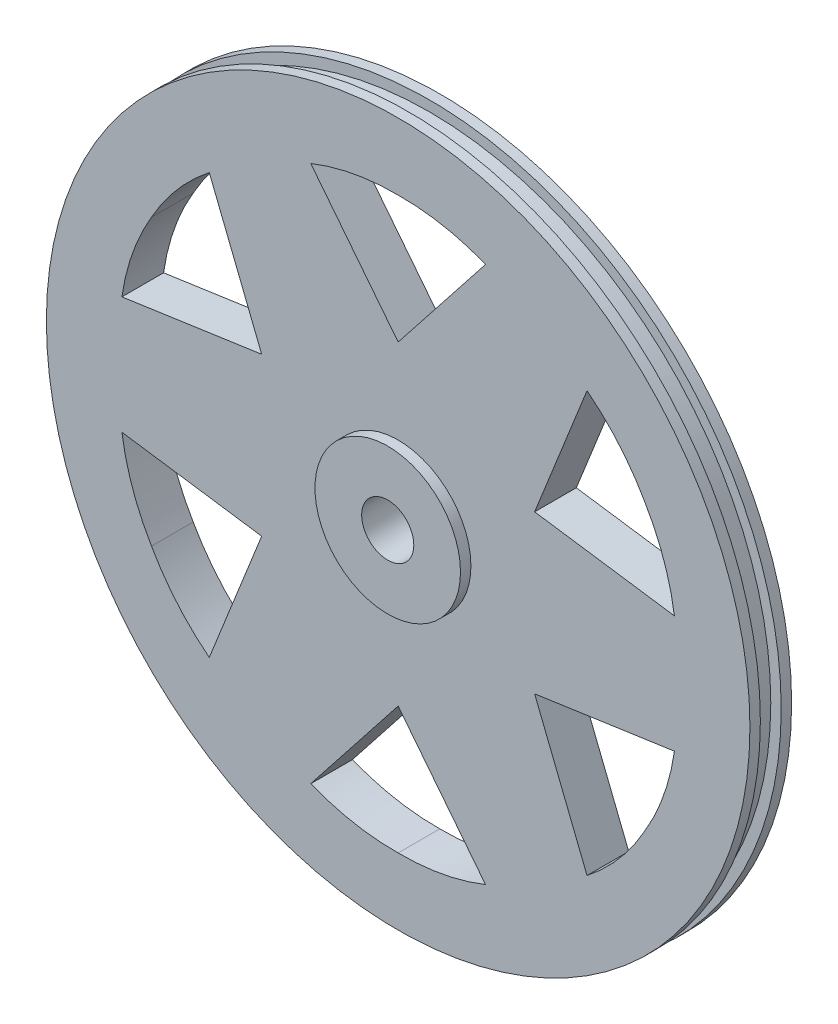
ISO-10303-21;
HEADER;
FILE_DESCRIPTION(('STEP AP214'),'2;1');
FILE_NAME('part.step','',(''),(''),'','','');
FILE_SCHEMA(('AUTOMOTIVE_DESIGN { 1 0 10303 214 1 1 1 1 }'));
ENDSEC;
DATA;
#1=APPLICATION_CONTEXT('core data for automotive mechanical design processes');
#2=APPLICATION_PROTOCOL_DEFINITION('international standard','automotive_design',2000,#1);
#3=PRODUCT_CONTEXT('',#1,'mechanical');
#4=PRODUCT('Part','Part','',(#3));
#5=PRODUCT_RELATED_PRODUCT_CATEGORY('part','',(#4));
#6=PRODUCT_DEFINITION_FORMATION('','',#4);
#7=PRODUCT_DEFINITION_CONTEXT('part definition',#1,'design');
#8=PRODUCT_DEFINITION('design','',#6,#7);
#9=PRODUCT_DEFINITION_SHAPE('','',#8);
#10=(LENGTH_UNIT() NAMED_UNIT(*) SI_UNIT(.MILLI.,.METRE.));
#11=(NAMED_UNIT(*) PLANE_ANGLE_UNIT() SI_UNIT($,.RADIAN.));
#12=(NAMED_UNIT(*) SI_UNIT($,.STERADIAN.) SOLID_ANGLE_UNIT());
#13=UNCERTAINTY_MEASURE_WITH_UNIT(LENGTH_MEASURE(1.E-05),#10,'distance_accuracy_value','');
#14=(GEOMETRIC_REPRESENTATION_CONTEXT(3) GLOBAL_UNCERTAINTY_ASSIGNED_CONTEXT((#13)) GLOBAL_UNIT_ASSIGNED_CONTEXT((#10,
#11,#12)) REPRESENTATION_CONTEXT('',''));
#15=CARTESIAN_POINT('',(0.,0.,0.));
#16=DIRECTION('',(0.,0.,1.));
#17=DIRECTION('',(1.,0.,0.));
#18=AXIS2_PLACEMENT_3D('',#15,#16,#17);
#19=CARTESIAN_POINT('',(0.,0.,4.));
#20=DIRECTION('',(0.,0.,1.));
#21=DIRECTION('',(1.,0.,0.));
#22=AXIS2_PLACEMENT_3D('',#19,#20,#21);
#23=PLANE('',#22);
#24=CARTESIAN_POINT('',(9.87087126814575,5.05606694384018,4.));
#25=DIRECTION('',(0.,0.,1.));
#26=DIRECTION('',(0.50000000000001,-0.866025403784433,0.));
#27=AXIS2_PLACEMENT_3D('',#24,#25,#26);
#28=CIRCLE('',#27,43.5801413510421);
#29=CARTESIAN_POINT('',(53.0096205020718,11.2429106229108,4.));
#30=VERTEX_POINT('',#29);
#31=CARTESIAN_POINT('',(47.3309241381744,27.3265217921694,4.));
#32=VERTEX_POINT('',#31);
#33=EDGE_CURVE('E301',#30,#32,#28,.T.);
#34=ORIENTED_EDGE('',*,*,#33,.F.);
#35=DIRECTION('',(0.989715541390064,-0.143049456940503,0.));
#36=VECTOR('',#35,1.);
#37=CARTESIAN_POINT('',(26.1879302612186,15.1196085858341,4.));
#38=LINE('',#37,#36);
#39=CARTESIAN_POINT('',(26.1879302612186,15.1196085858341,4.));
#40=VERTEX_POINT('',#39);
#41=EDGE_CURVE('E299',#40,#30,#38,.T.);
#42=ORIENTED_EDGE('',*,*,#41,.F.);
#43=DIRECTION('',(-0.370973306986966,-0.928643529834325,0.));
#44=VECTOR('',#43,1.);
#45=CARTESIAN_POINT('',(26.1879302612186,15.1196085858341,4.));
#46=LINE('',#45,#44);
#47=CARTESIAN_POINT('',(36.2414564629536,40.286222688312,4.));
#48=VERTEX_POINT('',#47);
#49=EDGE_CURVE('E306',#48,#40,#46,.T.);
#50=ORIENTED_EDGE('',*,*,#49,.F.);
#51=CARTESIAN_POINT('',(9.31411805067308,6.02039180378026,4.));
#52=DIRECTION('',(0.,0.,1.));
#53=DIRECTION('',(-0.50000000000001,0.866025403784433,0.));
#54=AXIS2_PLACEMENT_3D('',#51,#52,#53);
#55=CIRCLE('',#54,43.5801413510421);
#56=EDGE_CURVE('E304',#32,#48,#55,.T.);
#57=ORIENTED_EDGE('',*,*,#56,.F.);
#58=EDGE_LOOP('',(#34,#42,#50,#57));
#59=FACE_BOUND('',#58,.T.);
#60=CARTESIAN_POINT('',(9.3141180506732,-6.02039180378007,4.));
#61=DIRECTION('',(0.,0.,1.));
#62=DIRECTION('',(-0.499999999999992,-0.866025403784443,0.));
#63=AXIS2_PLACEMENT_3D('',#60,#61,#62);
#64=CIRCLE('',#63,43.5801413510421);
#65=CARTESIAN_POINT('',(36.2414564629545,-40.2862226883113,4.));
#66=VERTEX_POINT('',#65);
#67=CARTESIAN_POINT('',(47.3309241381749,-27.3265217921685,4.));
#68=VERTEX_POINT('',#67);
#69=EDGE_CURVE('E272',#66,#68,#64,.T.);
#70=ORIENTED_EDGE('',*,*,#69,.F.);
#71=DIRECTION('',(0.370973306986986,-0.928643529834317,0.));
#72=VECTOR('',#71,1.);
#73=CARTESIAN_POINT('',(26.1879302612189,-15.1196085858336,4.));
#74=LINE('',#73,#72);
#75=CARTESIAN_POINT('',(26.1879302612189,-15.1196085858336,4.));
#76=VERTEX_POINT('',#75);
#77=EDGE_CURVE('E270',#76,#66,#74,.T.);
#78=ORIENTED_EDGE('',*,*,#77,.F.);
#79=DIRECTION('',(-0.989715541390061,-0.143049456940524,0.));
#80=VECTOR('',#79,1.);
#81=CARTESIAN_POINT('',(26.1879302612189,-15.1196085858336,4.));
#82=LINE('',#81,#80);
#83=CARTESIAN_POINT('',(53.009620502072,-11.2429106229096,4.));
#84=VERTEX_POINT('',#83);
#85=EDGE_CURVE('E277',#84,#76,#82,.T.);
#86=ORIENTED_EDGE('',*,*,#85,.F.);
#87=CARTESIAN_POINT('',(9.87087126814585,-5.05606694383997,4.));
#88=DIRECTION('',(0.,0.,1.));
#89=DIRECTION('',(0.499999999999992,0.866025403784443,0.));
#90=AXIS2_PLACEMENT_3D('',#87,#88,#89);
#91=CIRCLE('',#90,43.5801413510421);
#92=EDGE_CURVE('E275',#68,#84,#91,.T.);
#93=ORIENTED_EDGE('',*,*,#92,.F.);
#94=EDGE_LOOP('',(#70,#78,#86,#93));
#95=FACE_BOUND('',#94,.T.);
#96=CARTESIAN_POINT('',(-0.556753217472661,-11.0764587476202,4.));
#97=DIRECTION('',(0.,0.,1.));
#98=DIRECTION('',(-1.,0.,0.));
#99=AXIS2_PLACEMENT_3D('',#96,#97,#98);
#100=CIRCLE('',#99,43.5801413510421);
#101=CARTESIAN_POINT('',(-16.7681640391178,-51.5291333112218,4.));
#102=VERTEX_POINT('',#101);
#103=CARTESIAN_POINT('',(0.,-54.6530435843378,4.));
#104=VERTEX_POINT('',#103);
#105=EDGE_CURVE('E241',#102,#104,#100,.T.);
#106=ORIENTED_EDGE('',*,*,#105,.F.);
#107=DIRECTION('',(-0.618742234403085,-0.785594072893805,0.));
#108=VECTOR('',#107,1.);
#109=CARTESIAN_POINT('',(0.,-30.2392171716676,4.));
#110=LINE('',#109,#108);
#111=CARTESIAN_POINT('',(0.,-30.2392171716676,4.));
#112=VERTEX_POINT('',#111);
#113=EDGE_CURVE('E239',#112,#102,#110,.T.);
#114=ORIENTED_EDGE('',*,*,#113,.F.);
#115=DIRECTION('',(-0.618742234403085,0.785594072893805,0.));
#116=VECTOR('',#115,1.);
#117=CARTESIAN_POINT('',(0.,-30.2392171716676,4.));
#118=LINE('',#117,#116);
#119=CARTESIAN_POINT('',(16.7681640391179,-51.5291333112218,4.));
#120=VERTEX_POINT('',#119);
#121=EDGE_CURVE('E247',#120,#112,#118,.T.);
#122=ORIENTED_EDGE('',*,*,#121,.F.);
#123=CARTESIAN_POINT('',(0.556753217472661,-11.0764587476202,4.));
#124=DIRECTION('',(0.,0.,1.));
#125=DIRECTION('',(1.,0.,0.));
#126=AXIS2_PLACEMENT_3D('',#123,#124,#125);
#127=CIRCLE('',#126,43.5801413510421);
#128=EDGE_CURVE('E244',#104,#120,#127,.T.);
#129=ORIENTED_EDGE('',*,*,#128,.F.);
#130=EDGE_LOOP('',(#106,#114,#122,#129));
#131=FACE_BOUND('',#130,.T.);
#132=CARTESIAN_POINT('',(-9.87087126814579,-5.05606694384011,4.));
#133=DIRECTION('',(0.,0.,1.));
#134=DIRECTION('',(-0.500000000000004,0.866025403784436,0.));
#135=AXIS2_PLACEMENT_3D('',#132,#133,#134);
#136=CIRCLE('',#135,43.5801413510421);
#137=CARTESIAN_POINT('',(-53.0096205020719,-11.2429106229104,4.));
#138=VERTEX_POINT('',#137);
#139=CARTESIAN_POINT('',(-47.3309241381746,-27.3265217921691,4.));
#140=VERTEX_POINT('',#139);
#141=EDGE_CURVE('E205',#138,#140,#136,.T.);
#142=ORIENTED_EDGE('',*,*,#141,.F.);
#143=DIRECTION('',(-0.989715541390063,0.14304945694051,0.));
#144=VECTOR('',#143,1.);
#145=CARTESIAN_POINT('',(-26.1879302612187,-15.1196085858339,4.));
#146=LINE('',#145,#144);
#147=CARTESIAN_POINT('',(-26.1879302612187,-15.1196085858339,4.));
#148=VERTEX_POINT('',#147);
#149=EDGE_CURVE('E195',#148,#138,#146,.T.);
#150=ORIENTED_EDGE('',*,*,#149,.F.);
#151=DIRECTION('',(0.370973306986973,0.928643529834322,0.));
#152=VECTOR('',#151,1.);
#153=CARTESIAN_POINT('',(-26.1879302612187,-15.1196085858339,4.));
#154=LINE('',#153,#152);
#155=CARTESIAN_POINT('',(-36.2414564629539,-40.2862226883118,4.));
#156=VERTEX_POINT('',#155);
#157=EDGE_CURVE('E221',#156,#148,#154,.T.);
#158=ORIENTED_EDGE('',*,*,#157,.F.);
#159=CARTESIAN_POINT('',(-9.31411805067312,-6.0203918037802,4.));
#160=DIRECTION('',(0.,0.,1.));
#161=DIRECTION('',(0.500000000000004,-0.866025403784436,0.));
#162=AXIS2_PLACEMENT_3D('',#159,#160,#161);
#163=CIRCLE('',#162,43.5801413510421);
#164=EDGE_CURVE('E219',#140,#156,#163,.T.);
#165=ORIENTED_EDGE('',*,*,#164,.F.);
#166=EDGE_LOOP('',(#142,#150,#158,#165));
#167=FACE_BOUND('',#166,.T.);
#168=CARTESIAN_POINT('',(-9.31411805067316,6.02039180378013,4.));
#169=DIRECTION('',(0.,0.,1.));
#170=DIRECTION('',(0.499999999999998,0.86602540378444,0.));
#171=AXIS2_PLACEMENT_3D('',#168,#169,#170);
#172=CIRCLE('',#171,43.5801413510421);
#173=CARTESIAN_POINT('',(-36.2414564629542,40.2862226883115,4.));
#174=VERTEX_POINT('',#173);
#175=CARTESIAN_POINT('',(-47.3309241381747,27.3265217921688,4.));
#176=VERTEX_POINT('',#175);
#177=EDGE_CURVE('E330',#174,#176,#172,.T.);
#178=ORIENTED_EDGE('',*,*,#177,.F.);
#179=DIRECTION('',(-0.370973306986979,0.928643529834319,0.));
#180=VECTOR('',#179,1.);
#181=CARTESIAN_POINT('',(-26.1879302612188,15.1196085858337,4.));
#182=LINE('',#181,#180);
#183=CARTESIAN_POINT('',(-26.1879302612188,15.1196085858337,4.));
#184=VERTEX_POINT('',#183);
#185=EDGE_CURVE('E328',#184,#174,#182,.T.);
#186=ORIENTED_EDGE('',*,*,#185,.F.);
#187=DIRECTION('',(0.989715541390062,0.143049456940517,0.));
#188=VECTOR('',#187,1.);
#189=CARTESIAN_POINT('',(-26.1879302612188,15.1196085858337,4.));
#190=LINE('',#189,#188);
#191=CARTESIAN_POINT('',(-53.0096205020719,11.24291062291,4.));
#192=VERTEX_POINT('',#191);
#193=EDGE_CURVE('E336',#192,#184,#190,.T.);
#194=ORIENTED_EDGE('',*,*,#193,.F.);
#195=CARTESIAN_POINT('',(-9.87087126814582,5.05606694384004,4.));
#196=DIRECTION('',(0.,0.,1.));
#197=DIRECTION('',(-0.499999999999998,-0.86602540378444,0.));
#198=AXIS2_PLACEMENT_3D('',#195,#196,#197);
#199=CIRCLE('',#198,43.5801413510421);
#200=EDGE_CURVE('E333',#176,#192,#199,.T.);
#201=ORIENTED_EDGE('',*,*,#200,.F.);
#202=EDGE_LOOP('',(#178,#186,#194,#201));
#203=FACE_BOUND('',#202,.T.);
#204=CARTESIAN_POINT('',(0.556753217472661,11.0764587476202,4.));
#205=DIRECTION('',(0.,0.,1.));
#206=DIRECTION('',(1.,0.,0.));
#207=AXIS2_PLACEMENT_3D('',#204,#205,#206);
#208=CIRCLE('',#207,43.5801413510421);
#209=CARTESIAN_POINT('',(16.7681640391178,51.5291333112218,4.));
#210=VERTEX_POINT('',#209);
#211=CARTESIAN_POINT('',(0.,54.6530435843378,4.));
#212=VERTEX_POINT('',#211);
#213=EDGE_CURVE('E361',#210,#212,#208,.T.);
#214=ORIENTED_EDGE('',*,*,#213,.F.);
#215=DIRECTION('',(0.618742234403085,0.785594072893805,0.));
#216=VECTOR('',#215,1.);
#217=CARTESIAN_POINT('',(0.,30.2392171716676,4.));
#218=LINE('',#217,#216);
#219=CARTESIAN_POINT('',(0.,30.2392171716676,4.));
#220=VERTEX_POINT('',#219);
#221=EDGE_CURVE('E359',#220,#210,#218,.T.);
#222=ORIENTED_EDGE('',*,*,#221,.F.);
#223=DIRECTION('',(0.618742234403085,-0.785594072893805,0.));
#224=VECTOR('',#223,1.);
#225=CARTESIAN_POINT('',(0.,30.2392171716676,4.));
#226=LINE('',#225,#224);
#227=CARTESIAN_POINT('',(-16.7681640391179,51.5291333112218,4.));
#228=VERTEX_POINT('',#227);
#229=EDGE_CURVE('E367',#228,#220,#226,.T.);
#230=ORIENTED_EDGE('',*,*,#229,.F.);
#231=CARTESIAN_POINT('',(-0.556753217472661,11.0764587476202,4.));
#232=DIRECTION('',(0.,0.,1.));
#233=DIRECTION('',(-1.,0.,0.));
#234=AXIS2_PLACEMENT_3D('',#231,#232,#233);
#235=CIRCLE('',#234,43.5801413510421);
#236=EDGE_CURVE('E364',#212,#228,#235,.T.);
#237=ORIENTED_EDGE('',*,*,#236,.F.);
#238=EDGE_LOOP('',(#214,#222,#230,#237));
#239=FACE_BOUND('',#238,.T.);
#240=CARTESIAN_POINT('',(0.,0.,4.));
#241=DIRECTION('',(0.,0.,1.));
#242=DIRECTION('',(1.,0.,0.));
#243=AXIS2_PLACEMENT_3D('',#240,#241,#242);
#244=CIRCLE('',#243,67.5);
#245=CARTESIAN_POINT('',(67.5,0.,4.));
#246=VERTEX_POINT('',#245);
#247=EDGE_CURVE('E11',#246,#246,#244,.T.);
#248=ORIENTED_EDGE('',*,*,#247,.T.);
#249=EDGE_LOOP('',(#248));
#250=FACE_BOUND('',#249,.T.);
#251=CARTESIAN_POINT('',(0.,0.,4.));
#252=DIRECTION('',(0.,0.,1.));
#253=DIRECTION('',(1.,0.,0.));
#254=AXIS2_PLACEMENT_3D('',#251,#252,#253);
#255=CIRCLE('',#254,13.9623807491948);
#256=CARTESIAN_POINT('',(13.9623807491948,0.,4.));
#257=VERTEX_POINT('',#256);
#258=EDGE_CURVE('E767',#257,#257,#255,.T.);
#259=ORIENTED_EDGE('',*,*,#258,.F.);
#260=EDGE_LOOP('',(#259));
#261=FACE_BOUND('',#260,.T.);
#262=ADVANCED_FACE('F33',(#59,#95,#131,#167,#203,#239,#250,#261),#23,.T.);
#263=CARTESIAN_POINT('',(0.,0.,4.));
#264=DIRECTION('',(0.,0.,-1.));
#265=DIRECTION('',(-1.,0.,0.));
#266=AXIS2_PLACEMENT_3D('',#263,#264,#265);
#267=CYLINDRICAL_SURFACE('',#266,67.5);
#268=CARTESIAN_POINT('',(0.,0.,-4.));
#269=DIRECTION('',(0.,0.,1.));
#270=DIRECTION('',(1.,0.,0.));
#271=AXIS2_PLACEMENT_3D('',#268,#269,#270);
#272=CIRCLE('',#271,67.5);
#273=CARTESIAN_POINT('',(67.5,0.,-4.));
#274=VERTEX_POINT('',#273);
#275=EDGE_CURVE('E37',#274,#274,#272,.T.);
#276=ORIENTED_EDGE('',*,*,#275,.T.);
#277=EDGE_LOOP('',(#276));
#278=FACE_BOUND('',#277,.T.);
#279=CARTESIAN_POINT('',(0.,0.,-2.));
#280=DIRECTION('',(0.,0.,1.));
#281=DIRECTION('',(1.,0.,0.));
#282=AXIS2_PLACEMENT_3D('',#279,#280,#281);
#283=CIRCLE('',#282,67.5);
#284=CARTESIAN_POINT('',(67.5,0.,-2.));
#285=VERTEX_POINT('',#284);
#286=EDGE_CURVE('E313',#285,#285,#283,.T.);
#287=ORIENTED_EDGE('',*,*,#286,.F.);
#288=EDGE_LOOP('',(#287));
#289=FACE_BOUND('',#288,.T.);
#290=ADVANCED_FACE('F396',(#278,#289),#267,.T.);
#291=CARTESIAN_POINT('',(0.,0.,-4.));
#292=DIRECTION('',(0.,0.,1.));
#293=DIRECTION('',(1.,0.,0.));
#294=AXIS2_PLACEMENT_3D('',#291,#292,#293);
#295=PLANE('',#294);
#296=DIRECTION('',(0.370973306986986,-0.928643529834317,0.));
#297=VECTOR('',#296,1.);
#298=CARTESIAN_POINT('',(26.1879302612189,-15.1196085858336,-4.));
#299=LINE('',#298,#297);
#300=CARTESIAN_POINT('',(26.1879302612189,-15.1196085858336,-4.));
#301=VERTEX_POINT('',#300);
#302=CARTESIAN_POINT('',(36.2414564629545,-40.2862226883113,-4.));
#303=VERTEX_POINT('',#302);
#304=EDGE_CURVE('E280',#301,#303,#299,.T.);
#305=ORIENTED_EDGE('',*,*,#304,.T.);
#306=CARTESIAN_POINT('',(9.3141180506732,-6.02039180378007,-4.));
#307=DIRECTION('',(0.,0.,1.));
#308=DIRECTION('',(-0.499999999999992,-0.866025403784443,0.));
#309=AXIS2_PLACEMENT_3D('',#306,#307,#308);
#310=CIRCLE('',#309,43.5801413510421);
#311=CARTESIAN_POINT('',(47.3309241381749,-27.3265217921685,-4.));
#312=VERTEX_POINT('',#311);
#313=EDGE_CURVE('E283',#303,#312,#310,.T.);
#314=ORIENTED_EDGE('',*,*,#313,.T.);
#315=CARTESIAN_POINT('',(9.87087126814585,-5.05606694383997,-4.));
#316=DIRECTION('',(0.,0.,1.));
#317=DIRECTION('',(0.499999999999992,0.866025403784443,0.));
#318=AXIS2_PLACEMENT_3D('',#315,#316,#317);
#319=CIRCLE('',#318,43.5801413510421);
#320=CARTESIAN_POINT('',(53.009620502072,-11.2429106229096,-4.));
#321=VERTEX_POINT('',#320);
#322=EDGE_CURVE('E287',#312,#321,#319,.T.);
#323=ORIENTED_EDGE('',*,*,#322,.T.);
#324=DIRECTION('',(-0.989715541390061,-0.143049456940524,0.));
#325=VECTOR('',#324,1.);
#326=CARTESIAN_POINT('',(26.1879302612189,-15.1196085858336,-4.));
#327=LINE('',#326,#325);
#328=EDGE_CURVE('E273',#321,#301,#327,.T.);
#329=ORIENTED_EDGE('',*,*,#328,.T.);
#330=EDGE_LOOP('',(#305,#314,#323,#329));
#331=FACE_BOUND('',#330,.T.);
#332=DIRECTION('',(-0.989715541390063,0.14304945694051,0.));
#333=VECTOR('',#332,1.);
#334=CARTESIAN_POINT('',(-26.1879302612187,-15.1196085858339,-4.));
#335=LINE('',#334,#333);
#336=CARTESIAN_POINT('',(-26.1879302612187,-15.1196085858339,-4.));
#337=VERTEX_POINT('',#336);
#338=CARTESIAN_POINT('',(-53.0096205020719,-11.2429106229104,-4.));
#339=VERTEX_POINT('',#338);
#340=EDGE_CURVE('E226',#337,#339,#335,.T.);
#341=ORIENTED_EDGE('',*,*,#340,.T.);
#342=CARTESIAN_POINT('',(-9.87087126814579,-5.05606694384011,-4.));
#343=DIRECTION('',(0.,0.,1.));
#344=DIRECTION('',(-0.500000000000004,0.866025403784436,0.));
#345=AXIS2_PLACEMENT_3D('',#342,#343,#344);
#346=CIRCLE('',#345,43.5801413510421);
#347=CARTESIAN_POINT('',(-47.3309241381746,-27.3265217921691,-4.));
#348=VERTEX_POINT('',#347);
#349=EDGE_CURVE('E212',#339,#348,#346,.T.);
#350=ORIENTED_EDGE('',*,*,#349,.T.);
#351=CARTESIAN_POINT('',(-9.31411805067312,-6.0203918037802,-4.));
#352=DIRECTION('',(0.,0.,1.));
#353=DIRECTION('',(0.500000000000004,-0.866025403784436,0.));
#354=AXIS2_PLACEMENT_3D('',#351,#352,#353);
#355=CIRCLE('',#354,43.5801413510421);
#356=CARTESIAN_POINT('',(-36.2414564629539,-40.2862226883118,-4.));
#357=VERTEX_POINT('',#356);
#358=EDGE_CURVE('E230',#348,#357,#355,.T.);
#359=ORIENTED_EDGE('',*,*,#358,.T.);
#360=DIRECTION('',(0.370973306986973,0.928643529834322,0.));
#361=VECTOR('',#360,1.);
#362=CARTESIAN_POINT('',(-26.1879302612187,-15.1196085858339,-4.));
#363=LINE('',#362,#361);
#364=EDGE_CURVE('E206',#357,#337,#363,.T.);
#365=ORIENTED_EDGE('',*,*,#364,.T.);
#366=EDGE_LOOP('',(#341,#350,#359,#365));
#367=FACE_BOUND('',#366,.T.);
#368=DIRECTION('',(0.618742234403085,0.785594072893805,0.));
#369=VECTOR('',#368,1.);
#370=CARTESIAN_POINT('',(0.,30.2392171716676,-4.));
#371=LINE('',#370,#369);
#372=CARTESIAN_POINT('',(0.,30.2392171716676,-4.));
#373=VERTEX_POINT('',#372);
#374=CARTESIAN_POINT('',(16.7681640391178,51.5291333112218,-4.));
#375=VERTEX_POINT('',#374);
#376=EDGE_CURVE('E358',#373,#375,#371,.T.);
#377=ORIENTED_EDGE('',*,*,#376,.T.);
#378=CARTESIAN_POINT('',(0.556753217472661,11.0764587476202,-4.));
#379=DIRECTION('',(0.,0.,1.));
#380=DIRECTION('',(1.,0.,0.));
#381=AXIS2_PLACEMENT_3D('',#378,#379,#380);
#382=CIRCLE('',#381,43.5801413510421);
#383=CARTESIAN_POINT('',(0.,54.6530435843378,-4.));
#384=VERTEX_POINT('',#383);
#385=EDGE_CURVE('E372',#375,#384,#382,.T.);
#386=ORIENTED_EDGE('',*,*,#385,.T.);
#387=CARTESIAN_POINT('',(-0.556753217472661,11.0764587476202,-4.));
#388=DIRECTION('',(0.,0.,1.));
#389=DIRECTION('',(-1.,0.,0.));
#390=AXIS2_PLACEMENT_3D('',#387,#388,#389);
#391=CIRCLE('',#390,43.5801413510421);
#392=CARTESIAN_POINT('',(-16.7681640391178,51.5291333112218,-4.));
#393=VERTEX_POINT('',#392);
#394=EDGE_CURVE('E375',#384,#393,#391,.T.);
#395=ORIENTED_EDGE('',*,*,#394,.T.);
#396=DIRECTION('',(0.618742234403085,-0.785594072893805,0.));
#397=VECTOR('',#396,1.);
#398=CARTESIAN_POINT('',(0.,30.2392171716676,-4.));
#399=LINE('',#398,#397);
#400=EDGE_CURVE('E362',#393,#373,#399,.T.);
#401=ORIENTED_EDGE('',*,*,#400,.T.);
#402=EDGE_LOOP('',(#377,#386,#395,#401));
#403=FACE_BOUND('',#402,.T.);
#404=ORIENTED_EDGE('',*,*,#275,.F.);
#405=EDGE_LOOP('',(#404));
#406=FACE_BOUND('',#405,.T.);
#407=CARTESIAN_POINT('',(0.,0.,-4.));
#408=DIRECTION('',(0.,0.,1.));
#409=DIRECTION('',(1.,0.,0.));
#410=AXIS2_PLACEMENT_3D('',#407,#408,#409);
#411=CIRCLE('',#410,5.);
#412=CARTESIAN_POINT('',(5.,0.,-4.));
#413=VERTEX_POINT('',#412);
#414=EDGE_CURVE('E389',#413,#413,#411,.T.);
#415=ORIENTED_EDGE('',*,*,#414,.T.);
#416=EDGE_LOOP('',(#415));
#417=FACE_BOUND('',#416,.T.);
#418=DIRECTION('',(-0.370973306986979,0.928643529834319,0.));
#419=VECTOR('',#418,1.);
#420=CARTESIAN_POINT('',(-26.1879302612188,15.1196085858337,-4.));
#421=LINE('',#420,#419);
#422=CARTESIAN_POINT('',(-26.1879302612188,15.1196085858337,-4.));
#423=VERTEX_POINT('',#422);
#424=CARTESIAN_POINT('',(-36.2414564629542,40.2862226883115,-4.));
#425=VERTEX_POINT('',#424);
#426=EDGE_CURVE('E213',#423,#425,#421,.T.);
#427=ORIENTED_EDGE('',*,*,#426,.T.);
#428=CARTESIAN_POINT('',(-9.31411805067316,6.02039180378013,-4.));
#429=DIRECTION('',(0.,0.,1.));
#430=DIRECTION('',(0.499999999999998,0.86602540378444,0.));
#431=AXIS2_PLACEMENT_3D('',#428,#429,#430);
#432=CIRCLE('',#431,43.5801413510421);
#433=CARTESIAN_POINT('',(-47.3309241381747,27.3265217921688,-4.));
#434=VERTEX_POINT('',#433);
#435=EDGE_CURVE('E341',#425,#434,#432,.T.);
#436=ORIENTED_EDGE('',*,*,#435,.T.);
#437=CARTESIAN_POINT('',(-9.87087126814582,5.05606694384004,-4.));
#438=DIRECTION('',(0.,0.,1.));
#439=DIRECTION('',(-0.499999999999998,-0.86602540378444,0.));
#440=AXIS2_PLACEMENT_3D('',#437,#438,#439);
#441=CIRCLE('',#440,43.5801413510421);
#442=CARTESIAN_POINT('',(-53.0096205020719,11.24291062291,-4.));
#443=VERTEX_POINT('',#442);
#444=EDGE_CURVE('E344',#434,#443,#441,.T.);
#445=ORIENTED_EDGE('',*,*,#444,.T.);
#446=DIRECTION('',(0.989715541390062,0.143049456940517,0.));
#447=VECTOR('',#446,1.);
#448=CARTESIAN_POINT('',(-26.1879302612188,15.1196085858337,-4.));
#449=LINE('',#448,#447);
#450=EDGE_CURVE('E331',#443,#423,#449,.T.);
#451=ORIENTED_EDGE('',*,*,#450,.T.);
#452=EDGE_LOOP('',(#427,#436,#445,#451));
#453=FACE_BOUND('',#452,.T.);
#454=DIRECTION('',(-0.618742234403085,-0.785594072893805,0.));
#455=VECTOR('',#454,1.);
#456=CARTESIAN_POINT('',(0.,-30.2392171716676,-4.));
#457=LINE('',#456,#455);
#458=CARTESIAN_POINT('',(0.,-30.2392171716676,-4.));
#459=VERTEX_POINT('',#458);
#460=CARTESIAN_POINT('',(-16.7681640391178,-51.5291333112218,-4.));
#461=VERTEX_POINT('',#460);
#462=EDGE_CURVE('E250',#459,#461,#457,.T.);
#463=ORIENTED_EDGE('',*,*,#462,.T.);
#464=CARTESIAN_POINT('',(-0.556753217472661,-11.0764587476202,-4.));
#465=DIRECTION('',(0.,0.,1.));
#466=DIRECTION('',(-1.,0.,0.));
#467=AXIS2_PLACEMENT_3D('',#464,#465,#466);
#468=CIRCLE('',#467,43.5801413510421);
#469=CARTESIAN_POINT('',(0.,-54.6530435843378,-4.));
#470=VERTEX_POINT('',#469);
#471=EDGE_CURVE('E253',#461,#470,#468,.T.);
#472=ORIENTED_EDGE('',*,*,#471,.T.);
#473=CARTESIAN_POINT('',(0.556753217472661,-11.0764587476202,-4.));
#474=DIRECTION('',(0.,0.,1.));
#475=DIRECTION('',(1.,0.,0.));
#476=AXIS2_PLACEMENT_3D('',#473,#474,#475);
#477=CIRCLE('',#476,43.5801413510421);
#478=CARTESIAN_POINT('',(16.7681640391178,-51.5291333112218,-4.));
#479=VERTEX_POINT('',#478);
#480=EDGE_CURVE('E257',#470,#479,#477,.T.);
#481=ORIENTED_EDGE('',*,*,#480,.T.);
#482=DIRECTION('',(-0.618742234403085,0.785594072893805,0.));
#483=VECTOR('',#482,1.);
#484=CARTESIAN_POINT('',(0.,-30.2392171716676,-4.));
#485=LINE('',#484,#483);
#486=EDGE_CURVE('E242',#479,#459,#485,.T.);
#487=ORIENTED_EDGE('',*,*,#486,.T.);
#488=EDGE_LOOP('',(#463,#472,#481,#487));
#489=FACE_BOUND('',#488,.T.);
#490=DIRECTION('',(0.989715541390064,-0.143049456940503,0.));
#491=VECTOR('',#490,1.);
#492=CARTESIAN_POINT('',(26.1879302612186,15.1196085858341,-4.));
#493=LINE('',#492,#491);
#494=CARTESIAN_POINT('',(26.1879302612186,15.1196085858341,-4.));
#495=VERTEX_POINT('',#494);
#496=CARTESIAN_POINT('',(53.0096205020718,11.2429106229108,-4.));
#497=VERTEX_POINT('',#496);
#498=EDGE_CURVE('E309',#495,#497,#493,.T.);
#499=ORIENTED_EDGE('',*,*,#498,.T.);
#500=CARTESIAN_POINT('',(9.87087126814575,5.05606694384018,-4.));
#501=DIRECTION('',(0.,0.,1.));
#502=DIRECTION('',(0.50000000000001,-0.866025403784433,0.));
#503=AXIS2_PLACEMENT_3D('',#500,#501,#502);
#504=CIRCLE('',#503,43.5801413510421);
#505=CARTESIAN_POINT('',(47.3309241381744,27.3265217921694,-4.));
#506=VERTEX_POINT('',#505);
#507=EDGE_CURVE('E312',#497,#506,#504,.T.);
#508=ORIENTED_EDGE('',*,*,#507,.T.);
#509=CARTESIAN_POINT('',(9.31411805067308,6.02039180378026,-4.));
#510=DIRECTION('',(0.,0.,1.));
#511=DIRECTION('',(-0.50000000000001,0.866025403784433,0.));
#512=AXIS2_PLACEMENT_3D('',#509,#510,#511);
#513=CIRCLE('',#512,43.5801413510421);
#514=CARTESIAN_POINT('',(36.2414564629536,40.286222688312,-4.));
#515=VERTEX_POINT('',#514);
#516=EDGE_CURVE('E316',#506,#515,#513,.T.);
#517=ORIENTED_EDGE('',*,*,#516,.T.);
#518=DIRECTION('',(-0.370973306986966,-0.928643529834325,0.));
#519=VECTOR('',#518,1.);
#520=CARTESIAN_POINT('',(26.1879302612186,15.1196085858341,-4.));
#521=LINE('',#520,#519);
#522=EDGE_CURVE('E302',#515,#495,#521,.T.);
#523=ORIENTED_EDGE('',*,*,#522,.T.);
#524=EDGE_LOOP('',(#499,#508,#517,#523));
#525=FACE_BOUND('',#524,.T.);
#526=ADVANCED_FACE('F399',(#331,#367,#403,#406,#417,#453,#489,#525),#295,.F.);
#527=CARTESIAN_POINT('',(0.,0.,2.));
#528=DIRECTION('',(0.,0.,1.));
#529=DIRECTION('',(1.,0.,0.));
#530=AXIS2_PLACEMENT_3D('',#527,#528,#529);
#531=CIRCLE('',#530,67.5);
#532=CARTESIAN_POINT('',(67.5,0.,2.));
#533=VERTEX_POINT('',#532);
#534=EDGE_CURVE('E779',#533,#533,#531,.T.);
#535=ORIENTED_EDGE('',*,*,#534,.T.);
#536=EDGE_LOOP('',(#535));
#537=FACE_BOUND('',#536,.T.);
#538=ORIENTED_EDGE('',*,*,#247,.F.);
#539=EDGE_LOOP('',(#538));
#540=FACE_BOUND('',#539,.T.);
#541=ADVANCED_FACE('F35',(#537,#540),#267,.T.);
#542=CARTESIAN_POINT('',(0.,0.,4.));
#543=DIRECTION('',(0.,0.,-1.));
#544=DIRECTION('',(-1.,0.,0.));
#545=AXIS2_PLACEMENT_3D('',#542,#543,#544);
#546=CYLINDRICAL_SURFACE('',#545,5.);
#547=ORIENTED_EDGE('',*,*,#414,.F.);
#548=EDGE_LOOP('',(#547));
#549=FACE_BOUND('',#548,.T.);
#550=CARTESIAN_POINT('',(0.,0.,6.));
#551=DIRECTION('',(0.,0.,1.));
#552=DIRECTION('',(1.,0.,0.));
#553=AXIS2_PLACEMENT_3D('',#550,#551,#552);
#554=CIRCLE('',#553,5.);
#555=CARTESIAN_POINT('',(5.,0.,6.));
#556=VERTEX_POINT('',#555);
#557=EDGE_CURVE('E769',#556,#556,#554,.T.);
#558=ORIENTED_EDGE('',*,*,#557,.T.);
#559=EDGE_LOOP('',(#558));
#560=FACE_BOUND('',#559,.T.);
#561=ADVANCED_FACE('F439',(#549,#560),#546,.F.);
#562=CARTESIAN_POINT('',(0.,30.2392171716676,4.));
#563=DIRECTION('',(-0.785594072893805,0.618742234403085,0.));
#564=DIRECTION('',(-0.618742234403085,-0.785594072893805,0.));
#565=AXIS2_PLACEMENT_3D('',#562,#563,#564);
#566=PLANE('',#565);
#567=ORIENTED_EDGE('',*,*,#376,.F.);
#568=DIRECTION('',(0.,0.,-1.));
#569=VECTOR('',#568,1.);
#570=CARTESIAN_POINT('',(0.,30.2392171716676,4.));
#571=LINE('',#570,#569);
#572=EDGE_CURVE('E369',#220,#373,#571,.T.);
#573=ORIENTED_EDGE('',*,*,#572,.F.);
#574=ORIENTED_EDGE('',*,*,#221,.T.);
#575=DIRECTION('',(0.,0.,-1.));
#576=VECTOR('',#575,1.);
#577=CARTESIAN_POINT('',(16.7681640391178,51.5291333112218,4.));
#578=LINE('',#577,#576);
#579=EDGE_CURVE('E386',#210,#375,#578,.T.);
#580=ORIENTED_EDGE('',*,*,#579,.T.);
#581=EDGE_LOOP('',(#567,#573,#574,#580));
#582=FACE_BOUND('',#581,.T.);
#583=ADVANCED_FACE('F442',(#582),#566,.T.);
#584=CARTESIAN_POINT('',(0.556753217472661,11.0764587476202,4.));
#585=DIRECTION('',(0.,0.,-1.));
#586=DIRECTION('',(-1.,0.,0.));
#587=AXIS2_PLACEMENT_3D('',#584,#585,#586);
#588=CYLINDRICAL_SURFACE('',#587,43.5801413510421);
#589=ORIENTED_EDGE('',*,*,#385,.F.);
#590=ORIENTED_EDGE('',*,*,#579,.F.);
#591=ORIENTED_EDGE('',*,*,#213,.T.);
#592=DIRECTION('',(0.,0.,-1.));
#593=VECTOR('',#592,1.);
#594=CARTESIAN_POINT('',(0.,54.6530435843378,4.));
#595=LINE('',#594,#593);
#596=EDGE_CURVE('E384',#212,#384,#595,.T.);
#597=ORIENTED_EDGE('',*,*,#596,.T.);
#598=EDGE_LOOP('',(#589,#590,#591,#597));
#599=FACE_BOUND('',#598,.T.);
#600=ADVANCED_FACE('F446',(#599),#588,.F.);
#601=CARTESIAN_POINT('',(-0.556753217472661,11.0764587476202,4.));
#602=DIRECTION('',(0.,0.,-1.));
#603=DIRECTION('',(-1.,0.,0.));
#604=AXIS2_PLACEMENT_3D('',#601,#602,#603);
#605=CYLINDRICAL_SURFACE('',#604,43.5801413510421);
#606=ORIENTED_EDGE('',*,*,#394,.F.);
#607=ORIENTED_EDGE('',*,*,#596,.F.);
#608=ORIENTED_EDGE('',*,*,#236,.T.);
#609=DIRECTION('',(0.,0.,-1.));
#610=VECTOR('',#609,1.);
#611=CARTESIAN_POINT('',(-16.7681640391178,51.5291333112218,4.));
#612=LINE('',#611,#610);
#613=EDGE_CURVE('E382',#228,#393,#612,.T.);
#614=ORIENTED_EDGE('',*,*,#613,.T.);
#615=EDGE_LOOP('',(#606,#607,#608,#614));
#616=FACE_BOUND('',#615,.T.);
#617=ADVANCED_FACE('F450',(#616),#605,.F.);
#618=CARTESIAN_POINT('',(0.,30.2392171716676,4.));
#619=DIRECTION('',(0.785594072893805,0.618742234403085,0.));
#620=DIRECTION('',(-0.618742234403085,0.785594072893805,0.));
#621=AXIS2_PLACEMENT_3D('',#618,#619,#620);
#622=PLANE('',#621);
#623=ORIENTED_EDGE('',*,*,#400,.F.);
#624=ORIENTED_EDGE('',*,*,#613,.F.);
#625=ORIENTED_EDGE('',*,*,#229,.T.);
#626=ORIENTED_EDGE('',*,*,#572,.T.);
#627=EDGE_LOOP('',(#623,#624,#625,#626));
#628=FACE_BOUND('',#627,.T.);
#629=ADVANCED_FACE('F454',(#628),#622,.T.);
#630=CARTESIAN_POINT('',(-26.1879302612188,15.1196085858337,4.));
#631=DIRECTION('',(-0.92864352983432,-0.370973306986979,0.));
#632=DIRECTION('',(0.370973306986979,-0.92864352983432,0.));
#633=AXIS2_PLACEMENT_3D('',#630,#631,#632);
#634=PLANE('',#633);
#635=ORIENTED_EDGE('',*,*,#426,.F.);
#636=DIRECTION('',(0.,0.,-1.));
#637=VECTOR('',#636,1.);
#638=CARTESIAN_POINT('',(-26.1879302612188,15.1196085858337,4.));
#639=LINE('',#638,#637);
#640=EDGE_CURVE('E338',#184,#423,#639,.T.);
#641=ORIENTED_EDGE('',*,*,#640,.F.);
#642=ORIENTED_EDGE('',*,*,#185,.T.);
#643=DIRECTION('',(0.,0.,-1.));
#644=VECTOR('',#643,1.);
#645=CARTESIAN_POINT('',(-36.2414564629542,40.2862226883115,4.));
#646=LINE('',#645,#644);
#647=EDGE_CURVE('E355',#174,#425,#646,.T.);
#648=ORIENTED_EDGE('',*,*,#647,.T.);
#649=EDGE_LOOP('',(#635,#641,#642,#648));
#650=FACE_BOUND('',#649,.T.);
#651=ADVANCED_FACE('F458',(#650),#634,.T.);
#652=CARTESIAN_POINT('',(-9.31411805067316,6.02039180378013,4.));
#653=DIRECTION('',(0.,0.,-1.));
#654=DIRECTION('',(-1.,0.,0.));
#655=AXIS2_PLACEMENT_3D('',#652,#653,#654);
#656=CYLINDRICAL_SURFACE('',#655,43.5801413510421);
#657=ORIENTED_EDGE('',*,*,#435,.F.);
#658=ORIENTED_EDGE('',*,*,#647,.F.);
#659=ORIENTED_EDGE('',*,*,#177,.T.);
#660=DIRECTION('',(0.,0.,-1.));
#661=VECTOR('',#660,1.);
#662=CARTESIAN_POINT('',(-47.3309241381747,27.3265217921688,4.));
#663=LINE('',#662,#661);
#664=EDGE_CURVE('E353',#176,#434,#663,.T.);
#665=ORIENTED_EDGE('',*,*,#664,.T.);
#666=EDGE_LOOP('',(#657,#658,#659,#665));
#667=FACE_BOUND('',#666,.T.);
#668=ADVANCED_FACE('F462',(#667),#656,.F.);
#669=CARTESIAN_POINT('',(-9.87087126814582,5.05606694384004,4.));
#670=DIRECTION('',(0.,0.,-1.));
#671=DIRECTION('',(-1.,0.,0.));
#672=AXIS2_PLACEMENT_3D('',#669,#670,#671);
#673=CYLINDRICAL_SURFACE('',#672,43.5801413510421);
#674=ORIENTED_EDGE('',*,*,#444,.F.);
#675=ORIENTED_EDGE('',*,*,#664,.F.);
#676=ORIENTED_EDGE('',*,*,#200,.T.);
#677=DIRECTION('',(0.,0.,-1.));
#678=VECTOR('',#677,1.);
#679=CARTESIAN_POINT('',(-53.0096205020719,11.24291062291,4.));
#680=LINE('',#679,#678);
#681=EDGE_CURVE('E351',#192,#443,#680,.T.);
#682=ORIENTED_EDGE('',*,*,#681,.T.);
#683=EDGE_LOOP('',(#674,#675,#676,#682));
#684=FACE_BOUND('',#683,.T.);
#685=ADVANCED_FACE('F466',(#684),#673,.F.);
#686=CARTESIAN_POINT('',(-26.1879302612188,15.1196085858337,4.));
#687=DIRECTION('',(-0.143049456940517,0.989715541390062,0.));
#688=DIRECTION('',(-0.989715541390062,-0.143049456940517,0.));
#689=AXIS2_PLACEMENT_3D('',#686,#687,#688);
#690=PLANE('',#689);
#691=ORIENTED_EDGE('',*,*,#450,.F.);
#692=ORIENTED_EDGE('',*,*,#681,.F.);
#693=ORIENTED_EDGE('',*,*,#193,.T.);
#694=ORIENTED_EDGE('',*,*,#640,.T.);
#695=EDGE_LOOP('',(#691,#692,#693,#694));
#696=FACE_BOUND('',#695,.T.);
#697=ADVANCED_FACE('F470',(#696),#690,.T.);
#698=CARTESIAN_POINT('',(-26.1879302612187,-15.1196085858339,4.));
#699=DIRECTION('',(-0.14304945694051,-0.989715541390063,0.));
#700=DIRECTION('',(0.989715541390063,-0.14304945694051,0.));
#701=AXIS2_PLACEMENT_3D('',#698,#699,#700);
#702=PLANE('',#701);
#703=ORIENTED_EDGE('',*,*,#340,.F.);
#704=DIRECTION('',(0.,0.,-1.));
#705=VECTOR('',#704,1.);
#706=CARTESIAN_POINT('',(-26.1879302612187,-15.1196085858339,4.));
#707=LINE('',#706,#705);
#708=EDGE_CURVE('E201',#148,#337,#707,.T.);
#709=ORIENTED_EDGE('',*,*,#708,.F.);
#710=ORIENTED_EDGE('',*,*,#149,.T.);
#711=DIRECTION('',(0.,0.,-1.));
#712=VECTOR('',#711,1.);
#713=CARTESIAN_POINT('',(-53.0096205020719,-11.2429106229104,4.));
#714=LINE('',#713,#712);
#715=EDGE_CURVE('E198',#138,#339,#714,.T.);
#716=ORIENTED_EDGE('',*,*,#715,.T.);
#717=EDGE_LOOP('',(#703,#709,#710,#716));
#718=FACE_BOUND('',#717,.T.);
#719=ADVANCED_FACE('F197',(#718),#702,.T.);
#720=CARTESIAN_POINT('',(-9.87087126814579,-5.05606694384011,4.));
#721=DIRECTION('',(0.,0.,-1.));
#722=DIRECTION('',(-1.,0.,0.));
#723=AXIS2_PLACEMENT_3D('',#720,#721,#722);
#724=CYLINDRICAL_SURFACE('',#723,43.5801413510421);
#725=ORIENTED_EDGE('',*,*,#349,.F.);
#726=ORIENTED_EDGE('',*,*,#715,.F.);
#727=ORIENTED_EDGE('',*,*,#141,.T.);
#728=DIRECTION('',(0.,0.,-1.));
#729=VECTOR('',#728,1.);
#730=CARTESIAN_POINT('',(-47.3309241381746,-27.3265217921691,4.));
#731=LINE('',#730,#729);
#732=EDGE_CURVE('E214',#140,#348,#731,.T.);
#733=ORIENTED_EDGE('',*,*,#732,.T.);
#734=EDGE_LOOP('',(#725,#726,#727,#733));
#735=FACE_BOUND('',#734,.T.);
#736=ADVANCED_FACE('F209',(#735),#724,.F.);
#737=CARTESIAN_POINT('',(-9.31411805067312,-6.0203918037802,4.));
#738=DIRECTION('',(0.,0.,-1.));
#739=DIRECTION('',(-1.,0.,0.));
#740=AXIS2_PLACEMENT_3D('',#737,#738,#739);
#741=CYLINDRICAL_SURFACE('',#740,43.5801413510421);
#742=ORIENTED_EDGE('',*,*,#358,.F.);
#743=ORIENTED_EDGE('',*,*,#732,.F.);
#744=ORIENTED_EDGE('',*,*,#164,.T.);
#745=DIRECTION('',(0.,0.,-1.));
#746=VECTOR('',#745,1.);
#747=CARTESIAN_POINT('',(-36.2414564629539,-40.2862226883118,4.));
#748=LINE('',#747,#746);
#749=EDGE_CURVE('E236',#156,#357,#748,.T.);
#750=ORIENTED_EDGE('',*,*,#749,.T.);
#751=EDGE_LOOP('',(#742,#743,#744,#750));
#752=FACE_BOUND('',#751,.T.);
#753=ADVANCED_FACE('F534',(#752),#741,.F.);
#754=CARTESIAN_POINT('',(-26.1879302612187,-15.1196085858339,4.));
#755=DIRECTION('',(-0.928643529834322,0.370973306986973,0.));
#756=DIRECTION('',(-0.370973306986973,-0.928643529834322,0.));
#757=AXIS2_PLACEMENT_3D('',#754,#755,#756);
#758=PLANE('',#757);
#759=ORIENTED_EDGE('',*,*,#364,.F.);
#760=ORIENTED_EDGE('',*,*,#749,.F.);
#761=ORIENTED_EDGE('',*,*,#157,.T.);
#762=ORIENTED_EDGE('',*,*,#708,.T.);
#763=EDGE_LOOP('',(#759,#760,#761,#762));
#764=FACE_BOUND('',#763,.T.);
#765=ADVANCED_FACE('F529',(#764),#758,.T.);
#766=CARTESIAN_POINT('',(0.,-30.2392171716676,4.));
#767=DIRECTION('',(0.785594072893805,-0.618742234403085,0.));
#768=DIRECTION('',(0.618742234403085,0.785594072893805,0.));
#769=AXIS2_PLACEMENT_3D('',#766,#767,#768);
#770=PLANE('',#769);
#771=ORIENTED_EDGE('',*,*,#462,.F.);
#772=DIRECTION('',(0.,0.,-1.));
#773=VECTOR('',#772,1.);
#774=CARTESIAN_POINT('',(0.,-30.2392171716676,4.));
#775=LINE('',#774,#773);
#776=EDGE_CURVE('E249',#112,#459,#775,.T.);
#777=ORIENTED_EDGE('',*,*,#776,.F.);
#778=ORIENTED_EDGE('',*,*,#113,.T.);
#779=DIRECTION('',(0.,0.,-1.));
#780=VECTOR('',#779,1.);
#781=CARTESIAN_POINT('',(-16.7681640391178,-51.5291333112218,4.));
#782=LINE('',#781,#780);
#783=EDGE_CURVE('E228',#102,#461,#782,.T.);
#784=ORIENTED_EDGE('',*,*,#783,.T.);
#785=EDGE_LOOP('',(#771,#777,#778,#784));
#786=FACE_BOUND('',#785,.T.);
#787=ADVANCED_FACE('F489',(#786),#770,.T.);
#788=CARTESIAN_POINT('',(-0.556753217472661,-11.0764587476202,4.));
#789=DIRECTION('',(0.,0.,-1.));
#790=DIRECTION('',(-1.,0.,0.));
#791=AXIS2_PLACEMENT_3D('',#788,#789,#790);
#792=CYLINDRICAL_SURFACE('',#791,43.5801413510421);
#793=ORIENTED_EDGE('',*,*,#471,.F.);
#794=ORIENTED_EDGE('',*,*,#783,.F.);
#795=ORIENTED_EDGE('',*,*,#105,.T.);
#796=DIRECTION('',(0.,0.,-1.));
#797=VECTOR('',#796,1.);
#798=CARTESIAN_POINT('',(0.,-54.6530435843378,4.));
#799=LINE('',#798,#797);
#800=EDGE_CURVE('E266',#104,#470,#799,.T.);
#801=ORIENTED_EDGE('',*,*,#800,.T.);
#802=EDGE_LOOP('',(#793,#794,#795,#801));
#803=FACE_BOUND('',#802,.T.);
#804=ADVANCED_FACE('F522',(#803),#792,.F.);
#805=CARTESIAN_POINT('',(0.556753217472661,-11.0764587476202,4.));
#806=DIRECTION('',(0.,0.,-1.));
#807=DIRECTION('',(-1.,0.,0.));
#808=AXIS2_PLACEMENT_3D('',#805,#806,#807);
#809=CYLINDRICAL_SURFACE('',#808,43.5801413510421);
#810=ORIENTED_EDGE('',*,*,#480,.F.);
#811=ORIENTED_EDGE('',*,*,#800,.F.);
#812=ORIENTED_EDGE('',*,*,#128,.T.);
#813=DIRECTION('',(0.,0.,-1.));
#814=VECTOR('',#813,1.);
#815=CARTESIAN_POINT('',(16.7681640391178,-51.5291333112218,4.));
#816=LINE('',#815,#814);
#817=EDGE_CURVE('E264',#120,#479,#816,.T.);
#818=ORIENTED_EDGE('',*,*,#817,.T.);
#819=EDGE_LOOP('',(#810,#811,#812,#818));
#820=FACE_BOUND('',#819,.T.);
#821=ADVANCED_FACE('F502',(#820),#809,.F.);
#822=CARTESIAN_POINT('',(0.,-30.2392171716676,4.));
#823=DIRECTION('',(-0.785594072893805,-0.618742234403085,0.));
#824=DIRECTION('',(0.618742234403085,-0.785594072893805,0.));
#825=AXIS2_PLACEMENT_3D('',#822,#823,#824);
#826=PLANE('',#825);
#827=ORIENTED_EDGE('',*,*,#486,.F.);
#828=ORIENTED_EDGE('',*,*,#817,.F.);
#829=ORIENTED_EDGE('',*,*,#121,.T.);
#830=ORIENTED_EDGE('',*,*,#776,.T.);
#831=EDGE_LOOP('',(#827,#828,#829,#830));
#832=FACE_BOUND('',#831,.T.);
#833=ADVANCED_FACE('F497',(#832),#826,.T.);
#834=CARTESIAN_POINT('',(26.1879302612189,-15.1196085858336,4.));
#835=DIRECTION('',(0.928643529834317,0.370973306986986,0.));
#836=DIRECTION('',(-0.370973306986986,0.928643529834317,0.));
#837=AXIS2_PLACEMENT_3D('',#834,#835,#836);
#838=PLANE('',#837);
#839=ORIENTED_EDGE('',*,*,#304,.F.);
#840=DIRECTION('',(0.,0.,-1.));
#841=VECTOR('',#840,1.);
#842=CARTESIAN_POINT('',(26.1879302612189,-15.1196085858336,4.));
#843=LINE('',#842,#841);
#844=EDGE_CURVE('E279',#76,#301,#843,.T.);
#845=ORIENTED_EDGE('',*,*,#844,.F.);
#846=ORIENTED_EDGE('',*,*,#77,.T.);
#847=DIRECTION('',(0.,0.,-1.));
#848=VECTOR('',#847,1.);
#849=CARTESIAN_POINT('',(36.2414564629545,-40.2862226883113,4.));
#850=LINE('',#849,#848);
#851=EDGE_CURVE('E254',#66,#303,#850,.T.);
#852=ORIENTED_EDGE('',*,*,#851,.T.);
#853=EDGE_LOOP('',(#839,#845,#846,#852));
#854=FACE_BOUND('',#853,.T.);
#855=ADVANCED_FACE('F494',(#854),#838,.T.);
#856=CARTESIAN_POINT('',(9.3141180506732,-6.02039180378007,4.));
#857=DIRECTION('',(0.,0.,-1.));
#858=DIRECTION('',(-1.,0.,0.));
#859=AXIS2_PLACEMENT_3D('',#856,#857,#858);
#860=CYLINDRICAL_SURFACE('',#859,43.5801413510421);
#861=ORIENTED_EDGE('',*,*,#313,.F.);
#862=ORIENTED_EDGE('',*,*,#851,.F.);
#863=ORIENTED_EDGE('',*,*,#69,.T.);
#864=DIRECTION('',(0.,0.,-1.));
#865=VECTOR('',#864,1.);
#866=CARTESIAN_POINT('',(47.3309241381749,-27.3265217921685,4.));
#867=LINE('',#866,#865);
#868=EDGE_CURVE('E295',#68,#312,#867,.T.);
#869=ORIENTED_EDGE('',*,*,#868,.T.);
#870=EDGE_LOOP('',(#861,#862,#863,#869));
#871=FACE_BOUND('',#870,.T.);
#872=ADVANCED_FACE('F485',(#871),#860,.F.);
#873=CARTESIAN_POINT('',(9.87087126814585,-5.05606694383997,4.));
#874=DIRECTION('',(0.,0.,-1.));
#875=DIRECTION('',(-1.,0.,0.));
#876=AXIS2_PLACEMENT_3D('',#873,#874,#875);
#877=CYLINDRICAL_SURFACE('',#876,43.5801413510421);
#878=ORIENTED_EDGE('',*,*,#322,.F.);
#879=ORIENTED_EDGE('',*,*,#868,.F.);
#880=ORIENTED_EDGE('',*,*,#92,.T.);
#881=DIRECTION('',(0.,0.,-1.));
#882=VECTOR('',#881,1.);
#883=CARTESIAN_POINT('',(53.009620502072,-11.2429106229096,4.));
#884=LINE('',#883,#882);
#885=EDGE_CURVE('E56',#84,#321,#884,.T.);
#886=ORIENTED_EDGE('',*,*,#885,.T.);
#887=EDGE_LOOP('',(#878,#879,#880,#886));
#888=FACE_BOUND('',#887,.T.);
#889=ADVANCED_FACE('F480',(#888),#877,.F.);
#890=CARTESIAN_POINT('',(26.1879302612189,-15.1196085858336,4.));
#891=DIRECTION('',(0.143049456940524,-0.989715541390061,0.));
#892=DIRECTION('',(0.989715541390061,0.143049456940524,0.));
#893=AXIS2_PLACEMENT_3D('',#890,#891,#892);
#894=PLANE('',#893);
#895=ORIENTED_EDGE('',*,*,#328,.F.);
#896=ORIENTED_EDGE('',*,*,#885,.F.);
#897=ORIENTED_EDGE('',*,*,#85,.T.);
#898=ORIENTED_EDGE('',*,*,#844,.T.);
#899=EDGE_LOOP('',(#895,#896,#897,#898));
#900=FACE_BOUND('',#899,.T.);
#901=ADVANCED_FACE('F476',(#900),#894,.T.);
#902=CARTESIAN_POINT('',(26.1879302612186,15.1196085858341,4.));
#903=DIRECTION('',(0.143049456940503,0.989715541390064,0.));
#904=DIRECTION('',(-0.989715541390064,0.143049456940503,0.));
#905=AXIS2_PLACEMENT_3D('',#902,#903,#904);
#906=PLANE('',#905);
#907=ORIENTED_EDGE('',*,*,#498,.F.);
#908=DIRECTION('',(0.,0.,-1.));
#909=VECTOR('',#908,1.);
#910=CARTESIAN_POINT('',(26.1879302612186,15.1196085858341,4.));
#911=LINE('',#910,#909);
#912=EDGE_CURVE('E308',#40,#495,#911,.T.);
#913=ORIENTED_EDGE('',*,*,#912,.F.);
#914=ORIENTED_EDGE('',*,*,#41,.T.);
#915=DIRECTION('',(0.,0.,-1.));
#916=VECTOR('',#915,1.);
#917=CARTESIAN_POINT('',(53.0096205020718,11.2429106229108,4.));
#918=LINE('',#917,#916);
#919=EDGE_CURVE('E284',#30,#497,#918,.T.);
#920=ORIENTED_EDGE('',*,*,#919,.T.);
#921=EDGE_LOOP('',(#907,#913,#914,#920));
#922=FACE_BOUND('',#921,.T.);
#923=ADVANCED_FACE('F407',(#922),#906,.T.);
#924=CARTESIAN_POINT('',(9.87087126814575,5.05606694384018,4.));
#925=DIRECTION('',(0.,0.,-1.));
#926=DIRECTION('',(-1.,0.,0.));
#927=AXIS2_PLACEMENT_3D('',#924,#925,#926);
#928=CYLINDRICAL_SURFACE('',#927,43.5801413510421);
#929=ORIENTED_EDGE('',*,*,#507,.F.);
#930=ORIENTED_EDGE('',*,*,#919,.F.);
#931=ORIENTED_EDGE('',*,*,#33,.T.);
#932=DIRECTION('',(0.,0.,-1.));
#933=VECTOR('',#932,1.);
#934=CARTESIAN_POINT('',(47.3309241381744,27.3265217921694,4.));
#935=LINE('',#934,#933);
#936=EDGE_CURVE('E324',#32,#506,#935,.T.);
#937=ORIENTED_EDGE('',*,*,#936,.T.);
#938=EDGE_LOOP('',(#929,#930,#931,#937));
#939=FACE_BOUND('',#938,.T.);
#940=ADVANCED_FACE('F417',(#939),#928,.F.);
#941=CARTESIAN_POINT('',(9.31411805067308,6.02039180378026,4.));
#942=DIRECTION('',(0.,0.,-1.));
#943=DIRECTION('',(-1.,0.,0.));
#944=AXIS2_PLACEMENT_3D('',#941,#942,#943);
#945=CYLINDRICAL_SURFACE('',#944,43.5801413510421);
#946=ORIENTED_EDGE('',*,*,#516,.F.);
#947=ORIENTED_EDGE('',*,*,#936,.F.);
#948=ORIENTED_EDGE('',*,*,#56,.T.);
#949=DIRECTION('',(0.,0.,-1.));
#950=VECTOR('',#949,1.);
#951=CARTESIAN_POINT('',(36.2414564629536,40.286222688312,4.));
#952=LINE('',#951,#950);
#953=EDGE_CURVE('E48',#48,#515,#952,.T.);
#954=ORIENTED_EDGE('',*,*,#953,.T.);
#955=EDGE_LOOP('',(#946,#947,#948,#954));
#956=FACE_BOUND('',#955,.T.);
#957=ADVANCED_FACE('F421',(#956),#945,.F.);
#958=CARTESIAN_POINT('',(26.1879302612186,15.1196085858341,4.));
#959=DIRECTION('',(0.928643529834325,-0.370973306986966,0.));
#960=DIRECTION('',(0.370973306986966,0.928643529834325,0.));
#961=AXIS2_PLACEMENT_3D('',#958,#959,#960);
#962=PLANE('',#961);
#963=ORIENTED_EDGE('',*,*,#522,.F.);
#964=ORIENTED_EDGE('',*,*,#953,.F.);
#965=ORIENTED_EDGE('',*,*,#49,.T.);
#966=ORIENTED_EDGE('',*,*,#912,.T.);
#967=EDGE_LOOP('',(#963,#964,#965,#966));
#968=FACE_BOUND('',#967,.T.);
#969=ADVANCED_FACE('F410',(#968),#962,.T.);
#970=CARTESIAN_POINT('',(0.,0.,-2.));
#971=DIRECTION('',(0.,0.,1.));
#972=DIRECTION('',(1.,0.,0.));
#973=AXIS2_PLACEMENT_3D('',#970,#971,#972);
#974=PLANE('',#973);
#975=CARTESIAN_POINT('',(0.,0.,-2.));
#976=DIRECTION('',(0.,0.,1.));
#977=DIRECTION('',(1.,0.,0.));
#978=AXIS2_PLACEMENT_3D('',#975,#976,#977);
#979=CIRCLE('',#978,65.5);
#980=CARTESIAN_POINT('',(65.5,0.,-2.));
#981=VERTEX_POINT('',#980);
#982=EDGE_CURVE('E776',#981,#981,#979,.T.);
#983=ORIENTED_EDGE('',*,*,#982,.F.);
#984=EDGE_LOOP('',(#983));
#985=FACE_BOUND('',#984,.T.);
#986=ORIENTED_EDGE('',*,*,#286,.T.);
#987=EDGE_LOOP('',(#986));
#988=FACE_BOUND('',#987,.T.);
#989=ADVANCED_FACE('F428',(#985,#988),#974,.T.);
#990=CARTESIAN_POINT('',(0.,0.,2.));
#991=DIRECTION('',(0.,0.,1.));
#992=DIRECTION('',(1.,0.,0.));
#993=AXIS2_PLACEMENT_3D('',#990,#991,#992);
#994=PLANE('',#993);
#995=CARTESIAN_POINT('',(0.,0.,2.));
#996=DIRECTION('',(0.,0.,1.));
#997=DIRECTION('',(1.,0.,0.));
#998=AXIS2_PLACEMENT_3D('',#995,#996,#997);
#999=CIRCLE('',#998,65.5);
#1000=CARTESIAN_POINT('',(65.5,0.,2.));
#1001=VERTEX_POINT('',#1000);
#1002=EDGE_CURVE('E771',#1001,#1001,#999,.T.);
#1003=ORIENTED_EDGE('',*,*,#1002,.T.);
#1004=EDGE_LOOP('',(#1003));
#1005=FACE_BOUND('',#1004,.T.);
#1006=ORIENTED_EDGE('',*,*,#534,.F.);
#1007=EDGE_LOOP('',(#1006));
#1008=FACE_BOUND('',#1007,.T.);
#1009=ADVANCED_FACE('F544',(#1005,#1008),#994,.F.);
#1010=CARTESIAN_POINT('',(0.,0.,-2.));
#1011=DIRECTION('',(0.,0.,1.));
#1012=DIRECTION('',(1.,0.,0.));
#1013=AXIS2_PLACEMENT_3D('',#1010,#1011,#1012);
#1014=CYLINDRICAL_SURFACE('',#1013,65.5);
#1015=ORIENTED_EDGE('',*,*,#982,.T.);
#1016=EDGE_LOOP('',(#1015));
#1017=FACE_BOUND('',#1016,.T.);
#1018=ORIENTED_EDGE('',*,*,#1002,.F.);
#1019=EDGE_LOOP('',(#1018));
#1020=FACE_BOUND('',#1019,.T.);
#1021=ADVANCED_FACE('F631',(#1017,#1020),#1014,.T.);
#1022=CARTESIAN_POINT('',(0.,0.,6.));
#1023=DIRECTION('',(0.,0.,1.));
#1024=DIRECTION('',(1.,0.,0.));
#1025=AXIS2_PLACEMENT_3D('',#1022,#1023,#1024);
#1026=PLANE('',#1025);
#1027=CARTESIAN_POINT('',(0.,0.,6.));
#1028=DIRECTION('',(0.,0.,1.));
#1029=DIRECTION('',(1.,0.,0.));
#1030=AXIS2_PLACEMENT_3D('',#1027,#1028,#1029);
#1031=CIRCLE('',#1030,13.9623807491948);
#1032=CARTESIAN_POINT('',(13.9623807491948,0.,6.));
#1033=VERTEX_POINT('',#1032);
#1034=EDGE_CURVE('E764',#1033,#1033,#1031,.T.);
#1035=ORIENTED_EDGE('',*,*,#1034,.T.);
#1036=EDGE_LOOP('',(#1035));
#1037=FACE_BOUND('',#1036,.T.);
#1038=ORIENTED_EDGE('',*,*,#557,.F.);
#1039=EDGE_LOOP('',(#1038));
#1040=FACE_BOUND('',#1039,.T.);
#1041=ADVANCED_FACE('F639',(#1037,#1040),#1026,.T.);
#1042=CARTESIAN_POINT('',(0.,0.,6.));
#1043=DIRECTION('',(0.,0.,-1.));
#1044=DIRECTION('',(-1.,0.,0.));
#1045=AXIS2_PLACEMENT_3D('',#1042,#1043,#1044);
#1046=CYLINDRICAL_SURFACE('',#1045,13.9623807491948);
#1047=ORIENTED_EDGE('',*,*,#1034,.F.);
#1048=EDGE_LOOP('',(#1047));
#1049=FACE_BOUND('',#1048,.T.);
#1050=ORIENTED_EDGE('',*,*,#258,.T.);
#1051=EDGE_LOOP('',(#1050));
#1052=FACE_BOUND('',#1051,.T.);
#1053=ADVANCED_FACE('F656',(#1049,#1052),#1046,.T.);
#1054=CLOSED_SHELL('',(#262,#290,#526,#541,#561,#583,#600,#617,#629,#651,#668,#685,#697,#719,
#736,#753,#765,#787,#804,#821,#833,#855,#872,#889,#901,#923,#940,#957,#969,#989,#1009,#1021,
#1041,#1053));
#1055=MANIFOLD_SOLID_BREP('B2',#1054);
#1056=ADVANCED_BREP_SHAPE_REPRESENTATION('',(#18,#1055),#14);
#1057=SHAPE_DEFINITION_REPRESENTATION(#9,#1056);
ENDSEC;
END-ISO-10303-21;
